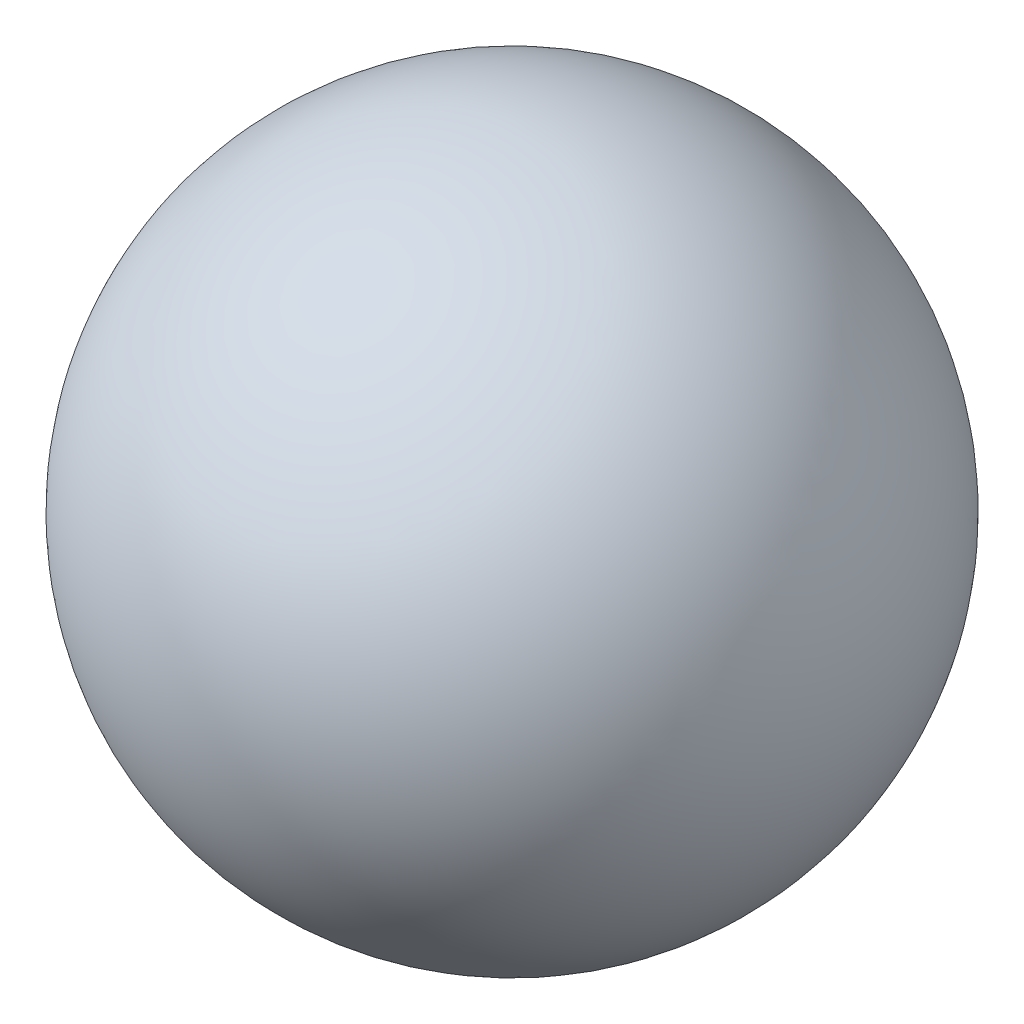
ISO-10303-21;
HEADER;
FILE_DESCRIPTION(('STEP AP214'),'2;1');
FILE_NAME('part.step','',(''),(''),'','','');
FILE_SCHEMA(('AUTOMOTIVE_DESIGN { 1 0 10303 214 1 1 1 1 }'));
ENDSEC;
DATA;
#1=APPLICATION_CONTEXT('core data for automotive mechanical design processes');
#2=APPLICATION_PROTOCOL_DEFINITION('international standard','automotive_design',2000,#1);
#3=PRODUCT_CONTEXT('',#1,'mechanical');
#4=PRODUCT('Part','Part','',(#3));
#5=PRODUCT_RELATED_PRODUCT_CATEGORY('part','',(#4));
#6=PRODUCT_DEFINITION_FORMATION('','',#4);
#7=PRODUCT_DEFINITION_CONTEXT('part definition',#1,'design');
#8=PRODUCT_DEFINITION('design','',#6,#7);
#9=PRODUCT_DEFINITION_SHAPE('','',#8);
#10=(LENGTH_UNIT() NAMED_UNIT(*) SI_UNIT(.MILLI.,.METRE.));
#11=(NAMED_UNIT(*) PLANE_ANGLE_UNIT() SI_UNIT($,.RADIAN.));
#12=(NAMED_UNIT(*) SI_UNIT($,.STERADIAN.) SOLID_ANGLE_UNIT());
#13=UNCERTAINTY_MEASURE_WITH_UNIT(LENGTH_MEASURE(1.E-05),#10,'distance_accuracy_value','');
#14=(GEOMETRIC_REPRESENTATION_CONTEXT(3) GLOBAL_UNCERTAINTY_ASSIGNED_CONTEXT((#13)) GLOBAL_UNIT_ASSIGNED_CONTEXT((#10,
#11,#12)) REPRESENTATION_CONTEXT('',''));
#15=CARTESIAN_POINT('',(0.,0.,0.));
#16=DIRECTION('',(0.,0.,1.));
#17=DIRECTION('',(1.,0.,0.));
#18=AXIS2_PLACEMENT_3D('',#15,#16,#17);
#19=CARTESIAN_POINT('',(620.801661110395,0.,0.));
#20=DIRECTION('',(1.,0.,0.));
#21=DIRECTION('',(0.,1.,0.));
#22=AXIS2_PLACEMENT_3D('',#19,#20,#21);
#23=SPHERICAL_SURFACE('',#22,50000.);
#24=CARTESIAN_POINT('',(50620.8016611104,0.,0.));
#25=VERTEX_POINT('',#24);
#26=VERTEX_LOOP('',#25);
#27=FACE_BOUND('',#26,.T.);
#28=ADVANCED_FACE('F50',(#27),#23,.T.);
#29=OPEN_SHELL('',(#28));
#30=SHELL_BASED_SURFACE_MODEL('B2',(#29));
#31=CARTESIAN_POINT('',(620.801661110395,0.,0.));
#32=DIRECTION('',(1.,0.,0.));
#33=DIRECTION('',(0.,1.,0.));
#34=AXIS2_PLACEMENT_3D('',#31,#32,#33);
#35=SPHERICAL_SURFACE('',#34,11250.);
#36=CARTESIAN_POINT('',(11870.8016611104,0.,0.));
#37=VERTEX_POINT('',#36);
#38=VERTEX_LOOP('',#37);
#39=FACE_BOUND('',#38,.T.);
#40=ADVANCED_FACE('F69',(#39),#35,.T.);
#41=OPEN_SHELL('',(#40));
#42=SHELL_BASED_SURFACE_MODEL('B6',(#41));
#43=CARTESIAN_POINT('',(5272.71739130435,0.,0.));
#44=DIRECTION('',(-1.,0.,0.));
#45=DIRECTION('',(0.,1.,0.));
#46=AXIS2_PLACEMENT_3D('',#43,#44,#45);
#47=SPHERICAL_SURFACE('',#46,5982.71739130435);
#48=CARTESIAN_POINT('',(-229.939705352571,0.,0.));
#49=DIRECTION('',(-1.,0.,0.));
#50=DIRECTION('',(0.,0.,1.));
#51=AXIS2_PLACEMENT_3D('',#48,#49,#50);
#52=CIRCLE('',#51,2348.12100642764);
#53=CARTESIAN_POINT('',(-229.939705352571,0.,2348.12100642764));
#54=VERTEX_POINT('',#53);
#55=EDGE_CURVE('E99',#54,#54,#52,.T.);
#56=ORIENTED_EDGE('',*,*,#55,.T.);
#57=EDGE_LOOP('',(#56));
#58=FACE_BOUND('',#57,.T.);
#59=ADVANCED_FACE('F81',(#58),#47,.T.);
#60=CARTESIAN_POINT('',(2575.,0.,0.));
#61=DIRECTION('',(-1.,0.,0.));
#62=DIRECTION('',(0.,0.,1.));
#63=AXIS2_PLACEMENT_3D('',#60,#61,#62);
#64=PLANE('',#63);
#65=CARTESIAN_POINT('',(2575.,0.,0.));
#66=DIRECTION('',(-1.,0.,0.));
#67=DIRECTION('',(0.,0.,1.));
#68=AXIS2_PLACEMENT_3D('',#65,#66,#67);
#69=CIRCLE('',#68,878.535400947932);
#70=CARTESIAN_POINT('',(2575.,0.,878.535400947932));
#71=VERTEX_POINT('',#70);
#72=EDGE_CURVE('E68',#71,#71,#69,.T.);
#73=ORIENTED_EDGE('',*,*,#72,.F.);
#74=EDGE_LOOP('',(#73));
#75=FACE_BOUND('',#74,.T.);
#76=ADVANCED_FACE('F118',(#75),#64,.F.);
#77=CARTESIAN_POINT('',(2525.,0.,0.));
#78=DIRECTION('',(-1.,0.,0.));
#79=DIRECTION('',(0.,0.,1.));
#80=AXIS2_PLACEMENT_3D('',#77,#78,#79);
#81=TOROIDAL_SURFACE('',#80,878.535400947932,49.9999999999995);
#82=CARTESIAN_POINT('',(2551.86498041734,0.,0.));
#83=DIRECTION('',(-1.,0.,0.));
#84=DIRECTION('',(0.,0.,1.));
#85=AXIS2_PLACEMENT_3D('',#82,#83,#84);
#86=CIRCLE('',#85,920.704973238576);
#87=CARTESIAN_POINT('',(2551.86498041734,0.,920.704973238576));
#88=VERTEX_POINT('',#87);
#89=EDGE_CURVE('E88',#88,#88,#86,.T.);
#90=ORIENTED_EDGE('',*,*,#89,.F.);
#91=EDGE_LOOP('',(#90));
#92=FACE_BOUND('',#91,.T.);
#93=ORIENTED_EDGE('',*,*,#72,.T.);
#94=EDGE_LOOP('',(#93));
#95=FACE_BOUND('',#94,.T.);
#96=ADVANCED_FACE('F114',(#92,#95),#81,.T.);
#97=CARTESIAN_POINT('',(2551.86498041734,0.,0.));
#98=DIRECTION('',(-1.,0.,0.));
#99=DIRECTION('',(0.,0.,1.));
#100=AXIS2_PLACEMENT_3D('',#97,#98,#99);
#101=CONICAL_SURFACE('',#100,920.704973238576,0.567232006898151);
#102=CARTESIAN_POINT('',(134.324902086705,0.,0.));
#103=DIRECTION('',(-1.,0.,0.));
#104=DIRECTION('',(0.,0.,1.));
#105=AXIS2_PLACEMENT_3D('',#102,#103,#104);
#106=CIRCLE('',#105,2460.84786145322);
#107=CARTESIAN_POINT('',(134.324902086705,0.,2460.84786145322));
#108=VERTEX_POINT('',#107);
#109=EDGE_CURVE('E95',#108,#108,#106,.T.);
#110=ORIENTED_EDGE('',*,*,#109,.F.);
#111=EDGE_LOOP('',(#110));
#112=FACE_BOUND('',#111,.T.);
#113=ORIENTED_EDGE('',*,*,#89,.T.);
#114=EDGE_LOOP('',(#113));
#115=FACE_BOUND('',#114,.T.);
#116=ADVANCED_FACE('F109',(#112,#115),#101,.T.);
#117=CARTESIAN_POINT('',(5.55111512312578E-13,0.,0.));
#118=DIRECTION('',(-1.,0.,0.));
#119=DIRECTION('',(0.,0.,1.));
#120=AXIS2_PLACEMENT_3D('',#117,#118,#119);
#121=TOROIDAL_SURFACE('',#120,2250.,249.999999999999);
#122=ORIENTED_EDGE('',*,*,#55,.F.);
#123=EDGE_LOOP('',(#122));
#124=FACE_BOUND('',#123,.T.);
#125=ORIENTED_EDGE('',*,*,#109,.T.);
#126=EDGE_LOOP('',(#125));
#127=FACE_BOUND('',#126,.T.);
#128=ADVANCED_FACE('F106',(#124,#127),#121,.T.);
#129=CLOSED_SHELL('',(#59,#76,#96,#116,#128));
#130=MANIFOLD_SOLID_BREP('B46',#129);
#131=ADVANCED_BREP_SHAPE_REPRESENTATION('',(#18,#130),#14);
#132=MANIFOLD_SURFACE_SHAPE_REPRESENTATION('',(#18,#30,#42),#14);
#133=SHAPE_REPRESENTATION('',(#18),#14);
#134=SHAPE_DEFINITION_REPRESENTATION(#9,#133);
#135=SHAPE_REPRESENTATION_RELATIONSHIP('','',#133,#131);
#136=SHAPE_REPRESENTATION_RELATIONSHIP('','',#133,#132);
ENDSEC;
END-ISO-10303-21;
